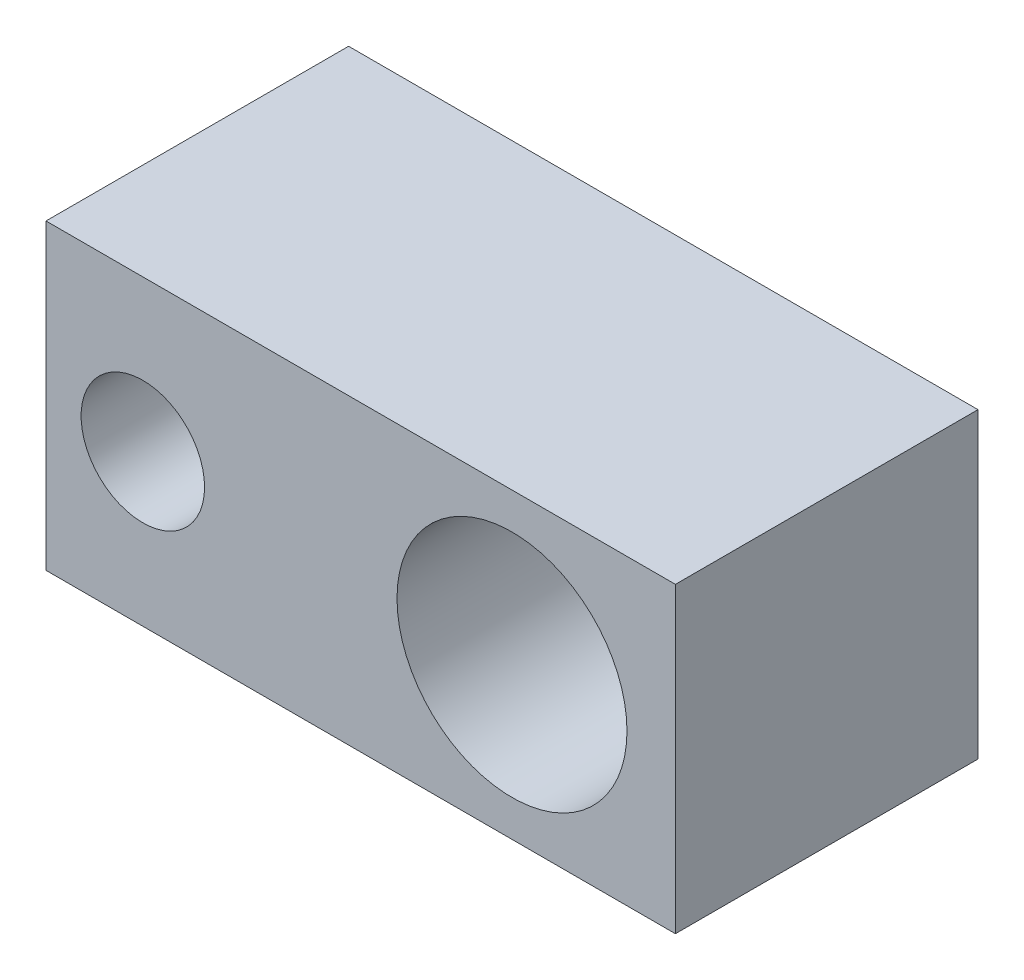
ISO-10303-21;
HEADER;
FILE_DESCRIPTION(('STEP AP214'),'2;1');
FILE_NAME('part.step','',(''),(''),'','','');
FILE_SCHEMA(('AUTOMOTIVE_DESIGN { 1 0 10303 214 1 1 1 1 }'));
ENDSEC;
DATA;
#1=APPLICATION_CONTEXT('core data for automotive mechanical design processes');
#2=APPLICATION_PROTOCOL_DEFINITION('international standard','automotive_design',2000,#1);
#3=PRODUCT_CONTEXT('',#1,'mechanical');
#4=PRODUCT('Part','Part','',(#3));
#5=PRODUCT_RELATED_PRODUCT_CATEGORY('part','',(#4));
#6=PRODUCT_DEFINITION_FORMATION('','',#4);
#7=PRODUCT_DEFINITION_CONTEXT('part definition',#1,'design');
#8=PRODUCT_DEFINITION('design','',#6,#7);
#9=PRODUCT_DEFINITION_SHAPE('','',#8);
#10=(LENGTH_UNIT() NAMED_UNIT(*) SI_UNIT(.MILLI.,.METRE.));
#11=(NAMED_UNIT(*) PLANE_ANGLE_UNIT() SI_UNIT($,.RADIAN.));
#12=(NAMED_UNIT(*) SI_UNIT($,.STERADIAN.) SOLID_ANGLE_UNIT());
#13=UNCERTAINTY_MEASURE_WITH_UNIT(LENGTH_MEASURE(1.E-05),#10,'distance_accuracy_value','');
#14=(GEOMETRIC_REPRESENTATION_CONTEXT(3) GLOBAL_UNCERTAINTY_ASSIGNED_CONTEXT((#13)) GLOBAL_UNIT_ASSIGNED_CONTEXT((#10,
#11,#12)) REPRESENTATION_CONTEXT('',''));
#15=CARTESIAN_POINT('',(0.,0.,0.));
#16=DIRECTION('',(0.,0.,1.));
#17=DIRECTION('',(1.,0.,0.));
#18=AXIS2_PLACEMENT_3D('',#15,#16,#17);
#19=CARTESIAN_POINT('',(0.,0.,25.));
#20=DIRECTION('',(0.,0.,-1.));
#21=DIRECTION('',(-1.,0.,0.));
#22=AXIS2_PLACEMENT_3D('',#19,#20,#21);
#23=PLANE('',#22);
#24=DIRECTION('',(0.,1.,0.));
#25=VECTOR('',#24,1.);
#26=CARTESIAN_POINT('',(26.,-12.5,25.));
#27=LINE('',#26,#25);
#28=CARTESIAN_POINT('',(26.,-12.5,25.));
#29=VERTEX_POINT('',#28);
#30=CARTESIAN_POINT('',(26.,12.5,25.));
#31=VERTEX_POINT('',#30);
#32=EDGE_CURVE('E92',#29,#31,#27,.T.);
#33=ORIENTED_EDGE('',*,*,#32,.T.);
#34=DIRECTION('',(-1.,0.,0.));
#35=VECTOR('',#34,1.);
#36=CARTESIAN_POINT('',(-26.,12.5,25.));
#37=LINE('',#36,#35);
#38=CARTESIAN_POINT('',(-26.,12.5,25.));
#39=VERTEX_POINT('',#38);
#40=EDGE_CURVE('E87',#31,#39,#37,.T.);
#41=ORIENTED_EDGE('',*,*,#40,.T.);
#42=DIRECTION('',(0.,-1.,0.));
#43=VECTOR('',#42,1.);
#44=CARTESIAN_POINT('',(-26.,-12.5,25.));
#45=LINE('',#44,#43);
#46=CARTESIAN_POINT('',(-26.,-12.5,25.));
#47=VERTEX_POINT('',#46);
#48=EDGE_CURVE('E90',#39,#47,#45,.T.);
#49=ORIENTED_EDGE('',*,*,#48,.T.);
#50=DIRECTION('',(1.,0.,0.));
#51=VECTOR('',#50,1.);
#52=CARTESIAN_POINT('',(-26.,-12.5,25.));
#53=LINE('',#52,#51);
#54=EDGE_CURVE('E57',#47,#29,#53,.T.);
#55=ORIENTED_EDGE('',*,*,#54,.T.);
#56=EDGE_LOOP('',(#33,#41,#49,#55));
#57=FACE_BOUND('',#56,.T.);
#58=CARTESIAN_POINT('',(12.5,0.,25.));
#59=DIRECTION('',(0.,0.,1.));
#60=DIRECTION('',(1.,0.,0.));
#61=AXIS2_PLACEMENT_3D('',#58,#59,#60);
#62=CIRCLE('',#61,9.50000000000001);
#63=CARTESIAN_POINT('',(22.,0.,25.));
#64=VERTEX_POINT('',#63);
#65=EDGE_CURVE('E112',#64,#64,#62,.T.);
#66=ORIENTED_EDGE('',*,*,#65,.F.);
#67=EDGE_LOOP('',(#66));
#68=FACE_BOUND('',#67,.T.);
#69=CARTESIAN_POINT('',(-18.,0.,25.));
#70=DIRECTION('',(0.,0.,1.));
#71=DIRECTION('',(1.,0.,0.));
#72=AXIS2_PLACEMENT_3D('',#69,#70,#71);
#73=CIRCLE('',#72,5.1);
#74=CARTESIAN_POINT('',(-12.9,0.,25.));
#75=VERTEX_POINT('',#74);
#76=EDGE_CURVE('E134',#75,#75,#73,.T.);
#77=ORIENTED_EDGE('',*,*,#76,.F.);
#78=EDGE_LOOP('',(#77));
#79=FACE_BOUND('',#78,.T.);
#80=ADVANCED_FACE('F39',(#57,#68,#79),#23,.F.);
#81=CARTESIAN_POINT('',(0.,0.,0.));
#82=DIRECTION('',(0.,0.,-1.));
#83=DIRECTION('',(-1.,0.,0.));
#84=AXIS2_PLACEMENT_3D('',#81,#82,#83);
#85=PLANE('',#84);
#86=CARTESIAN_POINT('',(12.5,0.,0.));
#87=DIRECTION('',(0.,0.,1.));
#88=DIRECTION('',(1.,0.,0.));
#89=AXIS2_PLACEMENT_3D('',#86,#87,#88);
#90=CIRCLE('',#89,9.50000000000001);
#91=CARTESIAN_POINT('',(22.,0.,0.));
#92=VERTEX_POINT('',#91);
#93=EDGE_CURVE('E130',#92,#92,#90,.T.);
#94=ORIENTED_EDGE('',*,*,#93,.T.);
#95=EDGE_LOOP('',(#94));
#96=FACE_BOUND('',#95,.T.);
#97=DIRECTION('',(0.,1.,0.));
#98=VECTOR('',#97,1.);
#99=CARTESIAN_POINT('',(26.,-12.5,0.));
#100=LINE('',#99,#98);
#101=CARTESIAN_POINT('',(26.,-12.5,0.));
#102=VERTEX_POINT('',#101);
#103=CARTESIAN_POINT('',(26.,12.5,0.));
#104=VERTEX_POINT('',#103);
#105=EDGE_CURVE('E108',#102,#104,#100,.T.);
#106=ORIENTED_EDGE('',*,*,#105,.F.);
#107=DIRECTION('',(1.,0.,0.));
#108=VECTOR('',#107,1.);
#109=CARTESIAN_POINT('',(-26.,-12.5,0.));
#110=LINE('',#109,#108);
#111=CARTESIAN_POINT('',(-26.,-12.5,0.));
#112=VERTEX_POINT('',#111);
#113=EDGE_CURVE('E80',#112,#102,#110,.T.);
#114=ORIENTED_EDGE('',*,*,#113,.F.);
#115=DIRECTION('',(0.,-1.,0.));
#116=VECTOR('',#115,1.);
#117=CARTESIAN_POINT('',(-26.,-12.5,0.));
#118=LINE('',#117,#116);
#119=CARTESIAN_POINT('',(-26.,12.5,0.));
#120=VERTEX_POINT('',#119);
#121=EDGE_CURVE('E74',#120,#112,#118,.T.);
#122=ORIENTED_EDGE('',*,*,#121,.F.);
#123=DIRECTION('',(-1.,0.,0.));
#124=VECTOR('',#123,1.);
#125=CARTESIAN_POINT('',(-26.,12.5,0.));
#126=LINE('',#125,#124);
#127=EDGE_CURVE('E97',#104,#120,#126,.T.);
#128=ORIENTED_EDGE('',*,*,#127,.F.);
#129=EDGE_LOOP('',(#106,#114,#122,#128));
#130=FACE_BOUND('',#129,.T.);
#131=CARTESIAN_POINT('',(-18.,0.,0.));
#132=DIRECTION('',(0.,0.,1.));
#133=DIRECTION('',(1.,0.,0.));
#134=AXIS2_PLACEMENT_3D('',#131,#132,#133);
#135=CIRCLE('',#134,5.1);
#136=CARTESIAN_POINT('',(-12.9,0.,0.));
#137=VERTEX_POINT('',#136);
#138=EDGE_CURVE('E138',#137,#137,#135,.T.);
#139=ORIENTED_EDGE('',*,*,#138,.T.);
#140=EDGE_LOOP('',(#139));
#141=FACE_BOUND('',#140,.T.);
#142=ADVANCED_FACE('F125',(#96,#130,#141),#85,.T.);
#143=CARTESIAN_POINT('',(26.,-12.5,25.));
#144=DIRECTION('',(-1.,0.,0.));
#145=DIRECTION('',(0.,0.,1.));
#146=AXIS2_PLACEMENT_3D('',#143,#144,#145);
#147=PLANE('',#146);
#148=ORIENTED_EDGE('',*,*,#105,.T.);
#149=DIRECTION('',(0.,0.,-1.));
#150=VECTOR('',#149,1.);
#151=CARTESIAN_POINT('',(26.,12.5,25.));
#152=LINE('',#151,#150);
#153=EDGE_CURVE('E11',#31,#104,#152,.T.);
#154=ORIENTED_EDGE('',*,*,#153,.F.);
#155=ORIENTED_EDGE('',*,*,#32,.F.);
#156=DIRECTION('',(0.,0.,-1.));
#157=VECTOR('',#156,1.);
#158=CARTESIAN_POINT('',(26.,-12.5,25.));
#159=LINE('',#158,#157);
#160=EDGE_CURVE('E104',#29,#102,#159,.T.);
#161=ORIENTED_EDGE('',*,*,#160,.T.);
#162=EDGE_LOOP('',(#148,#154,#155,#161));
#163=FACE_BOUND('',#162,.T.);
#164=ADVANCED_FACE('F41',(#163),#147,.F.);
#165=CARTESIAN_POINT('',(-26.,12.5,25.));
#166=DIRECTION('',(0.,-1.,0.));
#167=DIRECTION('',(0.,0.,-1.));
#168=AXIS2_PLACEMENT_3D('',#165,#166,#167);
#169=PLANE('',#168);
#170=ORIENTED_EDGE('',*,*,#127,.T.);
#171=DIRECTION('',(0.,0.,-1.));
#172=VECTOR('',#171,1.);
#173=CARTESIAN_POINT('',(-26.,12.5,25.));
#174=LINE('',#173,#172);
#175=EDGE_CURVE('E49',#39,#120,#174,.T.);
#176=ORIENTED_EDGE('',*,*,#175,.F.);
#177=ORIENTED_EDGE('',*,*,#40,.F.);
#178=ORIENTED_EDGE('',*,*,#153,.T.);
#179=EDGE_LOOP('',(#170,#176,#177,#178));
#180=FACE_BOUND('',#179,.T.);
#181=ADVANCED_FACE('F96',(#180),#169,.F.);
#182=CARTESIAN_POINT('',(-26.,-12.5,25.));
#183=DIRECTION('',(1.,0.,0.));
#184=DIRECTION('',(0.,0.,-1.));
#185=AXIS2_PLACEMENT_3D('',#182,#183,#184);
#186=PLANE('',#185);
#187=ORIENTED_EDGE('',*,*,#121,.T.);
#188=DIRECTION('',(0.,0.,-1.));
#189=VECTOR('',#188,1.);
#190=CARTESIAN_POINT('',(-26.,-12.5,25.));
#191=LINE('',#190,#189);
#192=EDGE_CURVE('E99',#47,#112,#191,.T.);
#193=ORIENTED_EDGE('',*,*,#192,.F.);
#194=ORIENTED_EDGE('',*,*,#48,.F.);
#195=ORIENTED_EDGE('',*,*,#175,.T.);
#196=EDGE_LOOP('',(#187,#193,#194,#195));
#197=FACE_BOUND('',#196,.T.);
#198=ADVANCED_FACE('F100',(#197),#186,.F.);
#199=CARTESIAN_POINT('',(-26.,-12.5,25.));
#200=DIRECTION('',(0.,1.,0.));
#201=DIRECTION('',(0.,0.,1.));
#202=AXIS2_PLACEMENT_3D('',#199,#200,#201);
#203=PLANE('',#202);
#204=ORIENTED_EDGE('',*,*,#113,.T.);
#205=ORIENTED_EDGE('',*,*,#160,.F.);
#206=ORIENTED_EDGE('',*,*,#54,.F.);
#207=ORIENTED_EDGE('',*,*,#192,.T.);
#208=EDGE_LOOP('',(#204,#205,#206,#207));
#209=FACE_BOUND('',#208,.T.);
#210=ADVANCED_FACE('F122',(#209),#203,.F.);
#211=CARTESIAN_POINT('',(12.5,0.,25.));
#212=DIRECTION('',(0.,0.,-1.));
#213=DIRECTION('',(-1.,0.,0.));
#214=AXIS2_PLACEMENT_3D('',#211,#212,#213);
#215=CYLINDRICAL_SURFACE('',#214,9.50000000000001);
#216=ORIENTED_EDGE('',*,*,#65,.T.);
#217=EDGE_LOOP('',(#216));
#218=FACE_BOUND('',#217,.T.);
#219=ORIENTED_EDGE('',*,*,#93,.F.);
#220=EDGE_LOOP('',(#219));
#221=FACE_BOUND('',#220,.T.);
#222=ADVANCED_FACE('F157',(#218,#221),#215,.F.);
#223=CARTESIAN_POINT('',(-18.,0.,25.));
#224=DIRECTION('',(0.,0.,-1.));
#225=DIRECTION('',(-1.,0.,0.));
#226=AXIS2_PLACEMENT_3D('',#223,#224,#225);
#227=CYLINDRICAL_SURFACE('',#226,5.1);
#228=ORIENTED_EDGE('',*,*,#76,.T.);
#229=EDGE_LOOP('',(#228));
#230=FACE_BOUND('',#229,.T.);
#231=ORIENTED_EDGE('',*,*,#138,.F.);
#232=EDGE_LOOP('',(#231));
#233=FACE_BOUND('',#232,.T.);
#234=ADVANCED_FACE('F146',(#230,#233),#227,.F.);
#235=CLOSED_SHELL('',(#80,#142,#164,#181,#198,#210,#222,#234));
#236=MANIFOLD_SOLID_BREP('B2',#235);
#237=ADVANCED_BREP_SHAPE_REPRESENTATION('',(#18,#236),#14);
#238=SHAPE_DEFINITION_REPRESENTATION(#9,#237);
ENDSEC;
END-ISO-10303-21;
